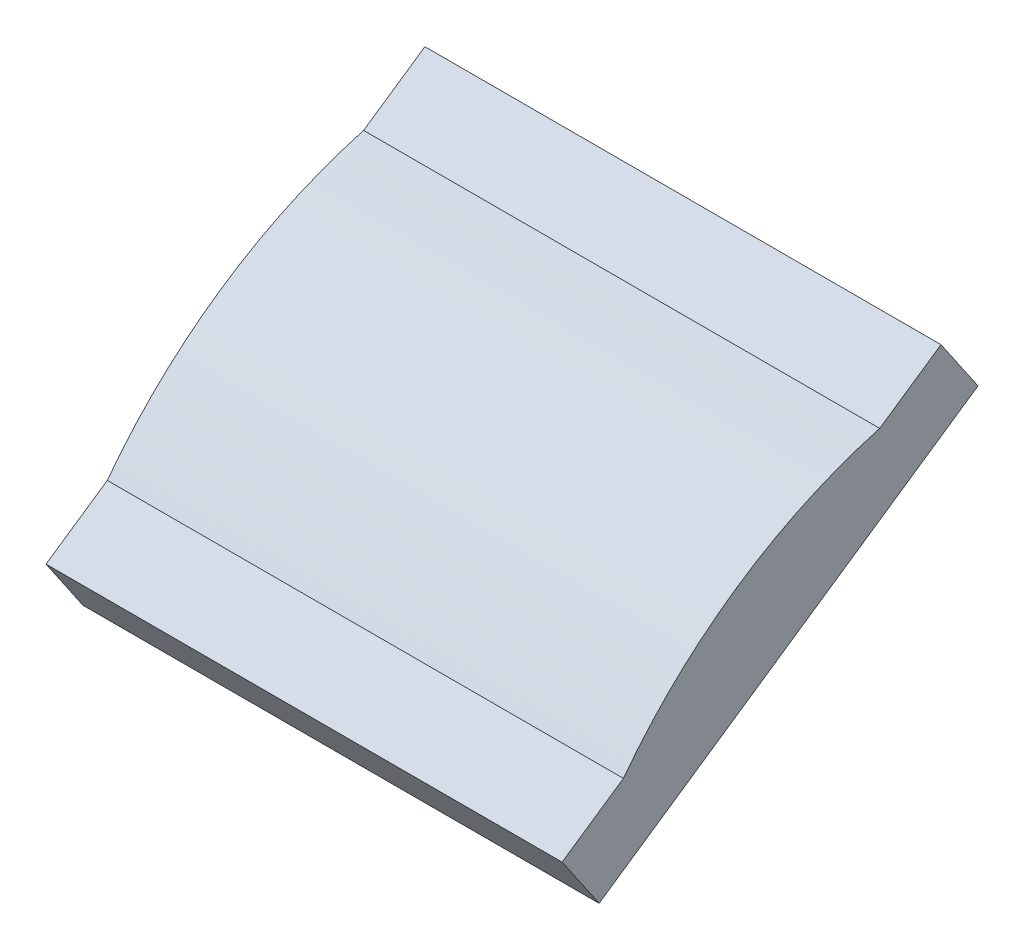
ISO-10303-21;
HEADER;
FILE_DESCRIPTION(('STEP AP214'),'2;1');
FILE_NAME('part.step','',(''),(''),'','','');
FILE_SCHEMA(('AUTOMOTIVE_DESIGN { 1 0 10303 214 1 1 1 1 }'));
ENDSEC;
DATA;
#1=APPLICATION_CONTEXT('core data for automotive mechanical design processes');
#2=APPLICATION_PROTOCOL_DEFINITION('international standard','automotive_design',2000,#1);
#3=PRODUCT_CONTEXT('',#1,'mechanical');
#4=PRODUCT('Part','Part','',(#3));
#5=PRODUCT_RELATED_PRODUCT_CATEGORY('part','',(#4));
#6=PRODUCT_DEFINITION_FORMATION('','',#4);
#7=PRODUCT_DEFINITION_CONTEXT('part definition',#1,'design');
#8=PRODUCT_DEFINITION('design','',#6,#7);
#9=PRODUCT_DEFINITION_SHAPE('','',#8);
#10=(LENGTH_UNIT() NAMED_UNIT(*) SI_UNIT(.MILLI.,.METRE.));
#11=(NAMED_UNIT(*) PLANE_ANGLE_UNIT() SI_UNIT($,.RADIAN.));
#12=(NAMED_UNIT(*) SI_UNIT($,.STERADIAN.) SOLID_ANGLE_UNIT());
#13=UNCERTAINTY_MEASURE_WITH_UNIT(LENGTH_MEASURE(1.E-05),#10,'distance_accuracy_value','');
#14=(GEOMETRIC_REPRESENTATION_CONTEXT(3) GLOBAL_UNCERTAINTY_ASSIGNED_CONTEXT((#13)) GLOBAL_UNIT_ASSIGNED_CONTEXT((#10,
#11,#12)) REPRESENTATION_CONTEXT('',''));
#15=CARTESIAN_POINT('',(0.,0.,0.));
#16=DIRECTION('',(0.,0.,1.));
#17=DIRECTION('',(1.,0.,0.));
#18=AXIS2_PLACEMENT_3D('',#15,#16,#17);
#19=CARTESIAN_POINT('',(5.,2.14734114764679,11.3943965351701));
#20=DIRECTION('',(0.,-0.185195909178902,-0.98270162064759));
#21=DIRECTION('',(0.,0.98270162064759,-0.185195909178902));
#22=AXIS2_PLACEMENT_3D('',#19,#20,#21);
#23=PLANE('',#22);
#24=DIRECTION('',(0.,-0.98270162064759,0.185195909178902));
#25=VECTOR('',#24,1.);
#26=CARTESIAN_POINT('',(0.,2.14734114764679,11.3943965351701));
#27=LINE('',#26,#25);
#28=CARTESIAN_POINT('',(0.,50.3985308913784,2.30117559627985));
#29=VERTEX_POINT('',#28);
#30=CARTESIAN_POINT('',(0.,3.98553334819268,11.0479783867994));
#31=VERTEX_POINT('',#30);
#32=EDGE_CURVE('E159',#29,#31,#27,.T.);
#33=ORIENTED_EDGE('',*,*,#32,.T.);
#34=DIRECTION('',(-1.,0.,0.));
#35=VECTOR('',#34,1.);
#36=CARTESIAN_POINT('',(5.,3.98553334819268,11.0479783867994));
#37=LINE('',#36,#35);
#38=CARTESIAN_POINT('',(5.,3.98553334819268,11.0479783867994));
#39=VERTEX_POINT('',#38);
#40=EDGE_CURVE('E200',#39,#31,#37,.T.);
#41=ORIENTED_EDGE('',*,*,#40,.F.);
#42=DIRECTION('',(0.,-0.98270162064759,0.185195909178902));
#43=VECTOR('',#42,1.);
#44=CARTESIAN_POINT('',(5.,2.14734114764679,11.3943965351701));
#45=LINE('',#44,#43);
#46=CARTESIAN_POINT('',(5.,50.3985308913779,2.30117559627943));
#47=VERTEX_POINT('',#46);
#48=EDGE_CURVE('E105',#47,#39,#45,.T.);
#49=ORIENTED_EDGE('',*,*,#48,.F.);
#50=DIRECTION('',(-1.,0.,0.));
#51=VECTOR('',#50,1.);
#52=CARTESIAN_POINT('',(5.,50.3985308913784,2.30117559627985));
#53=LINE('',#52,#51);
#54=EDGE_CURVE('E48',#47,#29,#53,.T.);
#55=ORIENTED_EDGE('',*,*,#54,.T.);
#56=EDGE_LOOP('',(#33,#41,#49,#55));
#57=FACE_BOUND('',#56,.T.);
#58=ADVANCED_FACE('F45',(#57),#23,.F.);
#59=CARTESIAN_POINT('',(5.,7.86317401586677,5.3694147198493));
#60=DIRECTION('',(0.,-0.825828263071328,-0.563921696614516));
#61=DIRECTION('',(0.,0.563921696614516,-0.825828263071328));
#62=AXIS2_PLACEMENT_3D('',#59,#60,#61);
#63=PLANE('',#62);
#64=DIRECTION('',(0.,-0.563921696614516,0.825828263071328));
#65=VECTOR('',#64,1.);
#66=CARTESIAN_POINT('',(0.,7.86317401586677,5.3694147198493));
#67=LINE('',#66,#65);
#68=CARTESIAN_POINT('',(0.,-13.9415373871828,37.3010588698369));
#69=VERTEX_POINT('',#68);
#70=EDGE_CURVE('E163',#31,#69,#67,.T.);
#71=ORIENTED_EDGE('',*,*,#70,.T.);
#72=DIRECTION('',(-1.,0.,0.));
#73=VECTOR('',#72,1.);
#74=CARTESIAN_POINT('',(5.,-13.9415373871828,37.3010588698369));
#75=LINE('',#74,#73);
#76=CARTESIAN_POINT('',(5.,-13.9415373871828,37.3010588698369));
#77=VERTEX_POINT('',#76);
#78=EDGE_CURVE('E197',#77,#69,#75,.T.);
#79=ORIENTED_EDGE('',*,*,#78,.F.);
#80=DIRECTION('',(0.,-0.563921696614516,0.825828263071328));
#81=VECTOR('',#80,1.);
#82=CARTESIAN_POINT('',(5.,7.86317401586677,5.3694147198493));
#83=LINE('',#82,#81);
#84=EDGE_CURVE('E222',#39,#77,#83,.T.);
#85=ORIENTED_EDGE('',*,*,#84,.F.);
#86=ORIENTED_EDGE('',*,*,#40,.T.);
#87=EDGE_LOOP('',(#71,#79,#85,#86));
#88=FACE_BOUND('',#87,.T.);
#89=ADVANCED_FACE('F218',(#88),#63,.F.);
#90=CARTESIAN_POINT('',(5.,-16.4791850219481,41.0172860536579));
#91=DIRECTION('',(-1.,0.,0.));
#92=DIRECTION('',(0.,0.,1.));
#93=AXIS2_PLACEMENT_3D('',#90,#91,#92);
#94=CYLINDRICAL_SURFACE('',#93,4.50000000000001);
#95=CARTESIAN_POINT('',(0.,-16.4791850219481,41.0172860536579));
#96=DIRECTION('',(1.,0.,0.));
#97=DIRECTION('',(0.,0.,-1.));
#98=AXIS2_PLACEMENT_3D('',#95,#96,#97);
#99=CIRCLE('',#98,4.50000000000001);
#100=CARTESIAN_POINT('',(0.,-16.1844106378081,36.5269510926048));
#101=VERTEX_POINT('',#100);
#102=EDGE_CURVE('E166',#69,#101,#99,.T.);
#103=ORIENTED_EDGE('',*,*,#102,.T.);
#104=DIRECTION('',(-1.,0.,0.));
#105=VECTOR('',#104,1.);
#106=CARTESIAN_POINT('',(5.,-16.1844106378081,36.5269510926048));
#107=LINE('',#106,#105);
#108=CARTESIAN_POINT('',(5.,-16.1844106378081,36.5269510926048));
#109=VERTEX_POINT('',#108);
#110=EDGE_CURVE('E133',#109,#101,#107,.T.);
#111=ORIENTED_EDGE('',*,*,#110,.F.);
#112=CARTESIAN_POINT('',(5.,-16.4791850219481,41.0172860536579));
#113=DIRECTION('',(1.,0.,0.));
#114=DIRECTION('',(0.,0.,-1.));
#115=AXIS2_PLACEMENT_3D('',#112,#113,#114);
#116=CIRCLE('',#115,4.50000000000001);
#117=EDGE_CURVE('E122',#77,#109,#116,.T.);
#118=ORIENTED_EDGE('',*,*,#117,.F.);
#119=ORIENTED_EDGE('',*,*,#78,.T.);
#120=EDGE_LOOP('',(#103,#111,#118,#119));
#121=FACE_BOUND('',#120,.T.);
#122=ADVANCED_FACE('F220',(#121),#94,.T.);
#123=CARTESIAN_POINT('',(5.,-13.7273897930276,-0.901153902144592));
#124=DIRECTION('',(0.,0.997852213567335,0.0655054186977738));
#125=DIRECTION('',(0.,-0.0655054186977738,0.997852213567335));
#126=AXIS2_PLACEMENT_3D('',#123,#124,#125);
#127=PLANE('',#126);
#128=DIRECTION('',(0.,0.0655054186977739,-0.997852213567335));
#129=VECTOR('',#128,1.);
#130=CARTESIAN_POINT('',(0.,-13.7273897930276,-0.901153902144592));
#131=LINE('',#130,#129);
#132=CARTESIAN_POINT('',(0.,-12.2095418312272,-24.022721226661));
#133=VERTEX_POINT('',#132);
#134=EDGE_CURVE('E131',#101,#133,#131,.T.);
#135=ORIENTED_EDGE('',*,*,#134,.T.);
#136=DIRECTION('',(-1.,0.,0.));
#137=VECTOR('',#136,1.);
#138=CARTESIAN_POINT('',(5.,-12.2095418312272,-24.022721226661));
#139=LINE('',#138,#137);
#140=CARTESIAN_POINT('',(5.,-12.2095418312272,-24.022721226661));
#141=VERTEX_POINT('',#140);
#142=EDGE_CURVE('E128',#141,#133,#139,.T.);
#143=ORIENTED_EDGE('',*,*,#142,.F.);
#144=DIRECTION('',(0.,0.0655054186977739,-0.997852213567335));
#145=VECTOR('',#144,1.);
#146=CARTESIAN_POINT('',(5.,-13.7273897930276,-0.901153902144592));
#147=LINE('',#146,#145);
#148=EDGE_CURVE('E115',#109,#141,#147,.T.);
#149=ORIENTED_EDGE('',*,*,#148,.F.);
#150=ORIENTED_EDGE('',*,*,#110,.T.);
#151=EDGE_LOOP('',(#135,#143,#149,#150));
#152=FACE_BOUND('',#151,.T.);
#153=ADVANCED_FACE('F129',(#152),#127,.F.);
#154=CARTESIAN_POINT('',(5.,-11.9147674470872,-28.513056187714));
#155=DIRECTION('',(-1.,0.,0.));
#156=DIRECTION('',(0.,0.,1.));
#157=AXIS2_PLACEMENT_3D('',#154,#155,#156);
#158=CYLINDRICAL_SURFACE('',#157,4.5);
#159=CARTESIAN_POINT('',(0.,-11.9147674470872,-28.513056187714));
#160=DIRECTION('',(1.,0.,0.));
#161=DIRECTION('',(0.,0.,-1.));
#162=AXIS2_PLACEMENT_3D('',#159,#160,#161);
#163=CIRCLE('',#162,4.5);
#164=CARTESIAN_POINT('',(0.,-7.66100021509012,-27.0449062171771));
#165=VERTEX_POINT('',#164);
#166=EDGE_CURVE('E90',#133,#165,#163,.T.);
#167=ORIENTED_EDGE('',*,*,#166,.T.);
#168=DIRECTION('',(-1.,0.,0.));
#169=VECTOR('',#168,1.);
#170=CARTESIAN_POINT('',(5.,-7.66100021509012,-27.0449062171771));
#171=LINE('',#170,#169);
#172=CARTESIAN_POINT('',(5.,-7.66100021509012,-27.0449062171771));
#173=VERTEX_POINT('',#172);
#174=EDGE_CURVE('E134',#173,#165,#171,.T.);
#175=ORIENTED_EDGE('',*,*,#174,.F.);
#176=CARTESIAN_POINT('',(5.,-11.9147674470872,-28.513056187714));
#177=DIRECTION('',(1.,0.,0.));
#178=DIRECTION('',(0.,0.,-1.));
#179=AXIS2_PLACEMENT_3D('',#176,#177,#178);
#180=CIRCLE('',#179,4.5);
#181=EDGE_CURVE('E120',#141,#173,#180,.T.);
#182=ORIENTED_EDGE('',*,*,#181,.F.);
#183=ORIENTED_EDGE('',*,*,#142,.T.);
#184=EDGE_LOOP('',(#167,#175,#182,#183));
#185=FACE_BOUND('',#184,.T.);
#186=ADVANCED_FACE('F136',(#185),#158,.T.);
#187=CARTESIAN_POINT('',(5.,7.52528279112857,-21.8034955493728));
#188=DIRECTION('',(0.,-0.326255549008214,0.945281607110468));
#189=DIRECTION('',(0.,-0.945281607110468,-0.326255549008214));
#190=AXIS2_PLACEMENT_3D('',#187,#188,#189);
#191=PLANE('',#190);
#192=DIRECTION('',(0.,0.945281607110468,0.326255549008214));
#193=VECTOR('',#192,1.);
#194=CARTESIAN_POINT('',(0.,7.52528279112857,-21.8034955493728));
#195=LINE('',#194,#193);
#196=CARTESIAN_POINT('',(0.,22.8148787981514,-16.5264273171522));
#197=VERTEX_POINT('',#196);
#198=EDGE_CURVE('E173',#165,#197,#195,.T.);
#199=ORIENTED_EDGE('',*,*,#198,.T.);
#200=DIRECTION('',(-1.,0.,0.));
#201=VECTOR('',#200,1.);
#202=CARTESIAN_POINT('',(5.,22.8148787981514,-16.5264273171522));
#203=LINE('',#202,#201);
#204=CARTESIAN_POINT('',(5.,22.8148787981514,-16.5264273171522));
#205=VERTEX_POINT('',#204);
#206=EDGE_CURVE('E97',#205,#197,#203,.T.);
#207=ORIENTED_EDGE('',*,*,#206,.F.);
#208=DIRECTION('',(0.,0.945281607110468,0.326255549008214));
#209=VECTOR('',#208,1.);
#210=CARTESIAN_POINT('',(5.,7.52528279112857,-21.8034955493728));
#211=LINE('',#210,#209);
#212=EDGE_CURVE('E63',#173,#205,#211,.T.);
#213=ORIENTED_EDGE('',*,*,#212,.F.);
#214=ORIENTED_EDGE('',*,*,#174,.T.);
#215=EDGE_LOOP('',(#199,#207,#213,#214));
#216=FACE_BOUND('',#215,.T.);
#217=ADVANCED_FACE('F384',(#216),#191,.F.);
#218=CARTESIAN_POINT('',(5.,-16.4791850219481,41.0172860536579));
#219=DIRECTION('',(-1.,0.,0.));
#220=DIRECTION('',(0.,0.,1.));
#221=AXIS2_PLACEMENT_3D('',#218,#219,#220);
#222=CYLINDRICAL_SURFACE('',#221,2.5);
#223=CARTESIAN_POINT('',(5.,-16.4791850219481,41.0172860536579));
#224=DIRECTION('',(1.,0.,0.));
#225=DIRECTION('',(0.,0.,-1.));
#226=AXIS2_PLACEMENT_3D('',#223,#224,#225);
#227=CIRCLE('',#226,2.5);
#228=CARTESIAN_POINT('',(5.,-16.4791850219481,38.5172860536579));
#229=VERTEX_POINT('',#228);
#230=EDGE_CURVE('E146',#229,#229,#227,.T.);
#231=ORIENTED_EDGE('',*,*,#230,.T.);
#232=EDGE_LOOP('',(#231));
#233=FACE_BOUND('',#232,.T.);
#234=CARTESIAN_POINT('',(0.,-16.4791850219481,41.0172860536579));
#235=DIRECTION('',(1.,0.,0.));
#236=DIRECTION('',(0.,0.,-1.));
#237=AXIS2_PLACEMENT_3D('',#234,#235,#236);
#238=CIRCLE('',#237,2.5);
#239=CARTESIAN_POINT('',(0.,-16.4791850219481,38.5172860536579));
#240=VERTEX_POINT('',#239);
#241=EDGE_CURVE('E180',#240,#240,#238,.T.);
#242=ORIENTED_EDGE('',*,*,#241,.F.);
#243=EDGE_LOOP('',(#242));
#244=FACE_BOUND('',#243,.T.);
#245=ADVANCED_FACE('F387',(#233,#244),#222,.F.);
#246=CARTESIAN_POINT('',(5.,1.27934877535807,1.52617620640661));
#247=DIRECTION('',(0.,-0.642414742923312,-0.766357160907873));
#248=DIRECTION('',(0.,0.766357160907873,-0.642414742923312));
#249=AXIS2_PLACEMENT_3D('',#246,#247,#248);
#250=PLANE('',#249);
#251=DIRECTION('',(0.,-0.766357160907873,0.642414742923312));
#252=VECTOR('',#251,1.);
#253=CARTESIAN_POINT('',(0.,1.27934877535807,1.52617620640661));
#254=LINE('',#253,#252);
#255=CARTESIAN_POINT('',(0.,117.368025310965,-95.7875582990304));
#256=VERTEX_POINT('',#255);
#257=EDGE_CURVE('E176',#256,#197,#254,.T.);
#258=ORIENTED_EDGE('',*,*,#257,.F.);
#259=DIRECTION('',(-1.,0.,0.));
#260=VECTOR('',#259,1.);
#261=CARTESIAN_POINT('',(5.,117.368025310965,-95.7875582990304));
#262=LINE('',#261,#260);
#263=CARTESIAN_POINT('',(5.,117.368025310965,-95.7875582990304));
#264=VERTEX_POINT('',#263);
#265=EDGE_CURVE('E154',#264,#256,#262,.T.);
#266=ORIENTED_EDGE('',*,*,#265,.F.);
#267=DIRECTION('',(0.,-0.766357160907873,0.642414742923312));
#268=VECTOR('',#267,1.);
#269=CARTESIAN_POINT('',(5.,1.27934877535807,1.52617620640661));
#270=LINE('',#269,#268);
#271=EDGE_CURVE('E140',#264,#205,#270,.T.);
#272=ORIENTED_EDGE('',*,*,#271,.T.);
#273=ORIENTED_EDGE('',*,*,#206,.T.);
#274=EDGE_LOOP('',(#258,#266,#272,#273));
#275=FACE_BOUND('',#274,.T.);
#276=ADVANCED_FACE('F389',(#275),#250,.T.);
#277=CARTESIAN_POINT('',(5.,-11.9147674470872,-28.513056187714));
#278=DIRECTION('',(-1.,0.,0.));
#279=DIRECTION('',(0.,0.,1.));
#280=AXIS2_PLACEMENT_3D('',#277,#278,#279);
#281=CYLINDRICAL_SURFACE('',#280,2.5);
#282=CARTESIAN_POINT('',(5.,-11.9147674470872,-28.513056187714));
#283=DIRECTION('',(1.,0.,0.));
#284=DIRECTION('',(0.,0.,-1.));
#285=AXIS2_PLACEMENT_3D('',#282,#283,#284);
#286=CIRCLE('',#285,2.5);
#287=CARTESIAN_POINT('',(5.,-11.9147674470872,-31.013056187714));
#288=VERTEX_POINT('',#287);
#289=EDGE_CURVE('E150',#288,#288,#286,.T.);
#290=ORIENTED_EDGE('',*,*,#289,.T.);
#291=EDGE_LOOP('',(#290));
#292=FACE_BOUND('',#291,.T.);
#293=CARTESIAN_POINT('',(0.,-11.9147674470872,-28.513056187714));
#294=DIRECTION('',(1.,0.,0.));
#295=DIRECTION('',(0.,0.,-1.));
#296=AXIS2_PLACEMENT_3D('',#293,#294,#295);
#297=CIRCLE('',#296,2.5);
#298=CARTESIAN_POINT('',(0.,-11.9147674470872,-31.013056187714));
#299=VERTEX_POINT('',#298);
#300=EDGE_CURVE('E184',#299,#299,#297,.T.);
#301=ORIENTED_EDGE('',*,*,#300,.F.);
#302=EDGE_LOOP('',(#301));
#303=FACE_BOUND('',#302,.T.);
#304=ADVANCED_FACE('F392',(#292,#303),#281,.F.);
#305=CARTESIAN_POINT('',(5.,0.,0.));
#306=DIRECTION('',(1.,0.,0.));
#307=DIRECTION('',(0.,0.,-1.));
#308=AXIS2_PLACEMENT_3D('',#305,#306,#307);
#309=PLANE('',#308);
#310=DIRECTION('',(0.,0.563858671546578,-0.825871296584237));
#311=VECTOR('',#310,1.);
#312=CARTESIAN_POINT('',(5.,50.3985308913784,2.30117559627985));
#313=LINE('',#312,#311);
#314=EDGE_CURVE('E11',#47,#264,#313,.T.);
#315=ORIENTED_EDGE('',*,*,#314,.F.);
#316=ORIENTED_EDGE('',*,*,#48,.T.);
#317=ORIENTED_EDGE('',*,*,#84,.T.);
#318=ORIENTED_EDGE('',*,*,#117,.T.);
#319=ORIENTED_EDGE('',*,*,#148,.T.);
#320=ORIENTED_EDGE('',*,*,#181,.T.);
#321=ORIENTED_EDGE('',*,*,#212,.T.);
#322=ORIENTED_EDGE('',*,*,#271,.F.);
#323=EDGE_LOOP('',(#315,#316,#317,#318,#319,#320,#321,#322));
#324=FACE_BOUND('',#323,.T.);
#325=ORIENTED_EDGE('',*,*,#230,.F.);
#326=EDGE_LOOP('',(#325));
#327=FACE_BOUND('',#326,.T.);
#328=ORIENTED_EDGE('',*,*,#289,.F.);
#329=EDGE_LOOP('',(#328));
#330=FACE_BOUND('',#329,.T.);
#331=ADVANCED_FACE('F117',(#324,#327,#330),#309,.T.);
#332=CARTESIAN_POINT('',(0.,0.,0.));
#333=DIRECTION('',(1.,0.,0.));
#334=DIRECTION('',(0.,0.,-1.));
#335=AXIS2_PLACEMENT_3D('',#332,#333,#334);
#336=PLANE('',#335);
#337=DIRECTION('',(0.,0.56385867154657,-0.825871296584242));
#338=VECTOR('',#337,1.);
#339=CARTESIAN_POINT('',(0.,35.4465924976813,24.2009483066669));
#340=LINE('',#339,#338);
#341=EDGE_CURVE('E155',#29,#256,#340,.T.);
#342=ORIENTED_EDGE('',*,*,#341,.T.);
#343=ORIENTED_EDGE('',*,*,#257,.T.);
#344=ORIENTED_EDGE('',*,*,#198,.F.);
#345=ORIENTED_EDGE('',*,*,#166,.F.);
#346=ORIENTED_EDGE('',*,*,#134,.F.);
#347=ORIENTED_EDGE('',*,*,#102,.F.);
#348=ORIENTED_EDGE('',*,*,#70,.F.);
#349=ORIENTED_EDGE('',*,*,#32,.F.);
#350=EDGE_LOOP('',(#342,#343,#344,#345,#346,#347,#348,#349));
#351=FACE_BOUND('',#350,.T.);
#352=ORIENTED_EDGE('',*,*,#241,.T.);
#353=EDGE_LOOP('',(#352));
#354=FACE_BOUND('',#353,.T.);
#355=ORIENTED_EDGE('',*,*,#300,.T.);
#356=EDGE_LOOP('',(#355));
#357=FACE_BOUND('',#356,.T.);
#358=ADVANCED_FACE('F214',(#351,#354,#357),#336,.F.);
#359=CARTESIAN_POINT('',(-271.45,-108.175443307666,234.560960334665));
#360=DIRECTION('',(0.,0.563858671546578,-0.825871296584237));
#361=DIRECTION('',(0.,0.825871296584237,0.563858671546578));
#362=AXIS2_PLACEMENT_3D('',#359,#360,#361);
#363=PLANE('',#362);
#364=DIRECTION('',(1.,0.,0.));
#365=VECTOR('',#364,1.);
#366=CARTESIAN_POINT('',(-271.45,-108.175443307666,234.560960334665));
#367=LINE('',#366,#365);
#368=CARTESIAN_POINT('',(-271.45,-108.175443307666,234.560960334665));
#369=VERTEX_POINT('',#368);
#370=CARTESIAN_POINT('',(178.55,-108.175443307666,234.560960334665));
#371=VERTEX_POINT('',#370);
#372=EDGE_CURVE('E247',#369,#371,#367,.T.);
#373=ORIENTED_EDGE('',*,*,#372,.T.);
#374=DIRECTION('',(0.,-0.825871296584237,-0.563858671546578));
#375=VECTOR('',#374,1.);
#376=CARTESIAN_POINT('',(178.55,-108.175443307666,234.560960334665));
#377=LINE('',#376,#375);
#378=CARTESIAN_POINT('',(178.55,-60.9356051430475,266.813676347129));
#379=VERTEX_POINT('',#378);
#380=EDGE_CURVE('E278',#379,#371,#377,.T.);
#381=ORIENTED_EDGE('',*,*,#380,.F.);
#382=DIRECTION('',(1.,0.,0.));
#383=VECTOR('',#382,1.);
#384=CARTESIAN_POINT('',(-271.45,-60.9356051430475,266.813676347129));
#385=LINE('',#384,#383);
#386=CARTESIAN_POINT('',(-271.45,-60.9356051430475,266.813676347129));
#387=VERTEX_POINT('',#386);
#388=EDGE_CURVE('E160',#387,#379,#385,.T.);
#389=ORIENTED_EDGE('',*,*,#388,.F.);
#390=DIRECTION('',(0.,0.825871296584237,0.563858671546578));
#391=VECTOR('',#390,1.);
#392=CARTESIAN_POINT('',(-271.45,-108.175443307666,234.560960334665));
#393=LINE('',#392,#391);
#394=EDGE_CURVE('E271',#369,#387,#393,.T.);
#395=ORIENTED_EDGE('',*,*,#394,.F.);
#396=EDGE_LOOP('',(#373,#381,#389,#395));
#397=FACE_BOUND('',#396,.T.);
#398=ADVANCED_FACE('F343',(#397),#363,.F.);
#399=CARTESIAN_POINT('',(-271.45,-60.9356051430475,266.813676347129));
#400=DIRECTION('',(0.,-0.825871296584237,-0.563858671546578));
#401=DIRECTION('',(0.,0.563858671546578,-0.825871296584237));
#402=AXIS2_PLACEMENT_3D('',#399,#400,#401);
#403=PLANE('',#402);
#404=ORIENTED_EDGE('',*,*,#388,.T.);
#405=DIRECTION('',(0.,-0.563858671546578,0.825871296584237));
#406=VECTOR('',#405,1.);
#407=CARTESIAN_POINT('',(178.55,-60.9356051430475,266.813676347129));
#408=LINE('',#407,#406);
#409=CARTESIAN_POINT('',(178.55,-24.442671920553,213.363286032197));
#410=VERTEX_POINT('',#409);
#411=EDGE_CURVE('E283',#410,#379,#408,.T.);
#412=ORIENTED_EDGE('',*,*,#411,.F.);
#413=DIRECTION('',(1.,0.,0.));
#414=VECTOR('',#413,1.);
#415=CARTESIAN_POINT('',(-271.45,-24.4426719205529,213.363286032197));
#416=LINE('',#415,#414);
#417=CARTESIAN_POINT('',(-271.45,-24.4426719205529,213.363286032197));
#418=VERTEX_POINT('',#417);
#419=EDGE_CURVE('E231',#418,#410,#416,.T.);
#420=ORIENTED_EDGE('',*,*,#419,.F.);
#421=DIRECTION('',(0.,0.563858671546578,-0.825871296584237));
#422=VECTOR('',#421,1.);
#423=CARTESIAN_POINT('',(-271.45,-60.9356051430475,266.813676347129));
#424=LINE('',#423,#422);
#425=EDGE_CURVE('E267',#387,#418,#424,.T.);
#426=ORIENTED_EDGE('',*,*,#425,.F.);
#427=EDGE_LOOP('',(#404,#412,#420,#426));
#428=FACE_BOUND('',#427,.T.);
#429=ADVANCED_FACE('F347',(#428),#403,.F.);
#430=CARTESIAN_POINT('',(-271.45,-275.113905810864,-121.583757266718));
#431=DIRECTION('',(1.,0.,0.));
#432=DIRECTION('',(0.,0.,-1.));
#433=AXIS2_PLACEMENT_3D('',#430,#431,#432);
#434=CYLINDRICAL_SURFACE('',#433,418.36059723016);
#435=ORIENTED_EDGE('',*,*,#419,.T.);
#436=CARTESIAN_POINT('',(178.55,-275.113905810861,-121.583757266716));
#437=DIRECTION('',(1.,0.,0.));
#438=DIRECTION('',(0.,0.,1.));
#439=AXIS2_PLACEMENT_3D('',#436,#437,#438);
#440=CIRCLE('',#439,418.360597230157);
#441=CARTESIAN_POINT('',(178.55,128.114930253089,-10.0844519716346));
#442=VERTEX_POINT('',#441);
#443=EDGE_CURVE('E287',#442,#410,#440,.T.);
#444=ORIENTED_EDGE('',*,*,#443,.F.);
#445=DIRECTION('',(1.,0.,0.));
#446=VECTOR('',#445,1.);
#447=CARTESIAN_POINT('',(-271.45,128.114930253089,-10.0844519716347));
#448=LINE('',#447,#446);
#449=CARTESIAN_POINT('',(-271.45,128.114930253089,-10.0844519716347));
#450=VERTEX_POINT('',#449);
#451=EDGE_CURVE('E235',#450,#442,#448,.T.);
#452=ORIENTED_EDGE('',*,*,#451,.F.);
#453=CARTESIAN_POINT('',(-271.45,-275.113905810864,-121.583757266718));
#454=DIRECTION('',(-1.,0.,0.));
#455=DIRECTION('',(0.,0.,-1.));
#456=AXIS2_PLACEMENT_3D('',#453,#454,#455);
#457=CIRCLE('',#456,418.36059723016);
#458=EDGE_CURVE('E263',#418,#450,#457,.T.);
#459=ORIENTED_EDGE('',*,*,#458,.F.);
#460=EDGE_LOOP('',(#435,#444,#452,#459));
#461=FACE_BOUND('',#460,.T.);
#462=ADVANCED_FACE('F355',(#461),#434,.T.);
#463=CARTESIAN_POINT('',(-271.45,164.607863475583,-63.5348422865665));
#464=DIRECTION('',(0.,-0.825871296584237,-0.563858671546578));
#465=DIRECTION('',(0.,0.563858671546578,-0.825871296584237));
#466=AXIS2_PLACEMENT_3D('',#463,#464,#465);
#467=PLANE('',#466);
#468=ORIENTED_EDGE('',*,*,#451,.T.);
#469=DIRECTION('',(0.,-0.563858671546578,0.825871296584236));
#470=VECTOR('',#469,1.);
#471=CARTESIAN_POINT('',(178.55,164.607863475583,-63.5348422865665));
#472=LINE('',#471,#470);
#473=CARTESIAN_POINT('',(178.55,164.607863475583,-63.5348422865665));
#474=VERTEX_POINT('',#473);
#475=EDGE_CURVE('E291',#474,#442,#472,.T.);
#476=ORIENTED_EDGE('',*,*,#475,.F.);
#477=DIRECTION('',(1.,0.,0.));
#478=VECTOR('',#477,1.);
#479=CARTESIAN_POINT('',(-271.45,164.607863475583,-63.5348422865665));
#480=LINE('',#479,#478);
#481=CARTESIAN_POINT('',(-271.45,164.607863475583,-63.5348422865665));
#482=VERTEX_POINT('',#481);
#483=EDGE_CURVE('E239',#482,#474,#480,.T.);
#484=ORIENTED_EDGE('',*,*,#483,.F.);
#485=DIRECTION('',(0.,0.563858671546578,-0.825871296584236));
#486=VECTOR('',#485,1.);
#487=CARTESIAN_POINT('',(-271.45,164.607863475583,-63.5348422865665));
#488=LINE('',#487,#486);
#489=EDGE_CURVE('E259',#450,#482,#488,.T.);
#490=ORIENTED_EDGE('',*,*,#489,.F.);
#491=EDGE_LOOP('',(#468,#476,#484,#490));
#492=FACE_BOUND('',#491,.T.);
#493=ADVANCED_FACE('F362',(#492),#467,.F.);
#494=CARTESIAN_POINT('',(-271.45,117.368025310965,-95.7875582990304));
#495=DIRECTION('',(0.,-0.563858671546572,0.825871296584241));
#496=DIRECTION('',(0.,-0.825871296584241,-0.563858671546572));
#497=AXIS2_PLACEMENT_3D('',#494,#495,#496);
#498=PLANE('',#497);
#499=ORIENTED_EDGE('',*,*,#483,.T.);
#500=DIRECTION('',(0.,0.825871296584241,0.563858671546572));
#501=VECTOR('',#500,1.);
#502=CARTESIAN_POINT('',(178.55,117.368025310965,-95.7875582990304));
#503=LINE('',#502,#501);
#504=CARTESIAN_POINT('',(178.55,117.368025310965,-95.7875582990304));
#505=VERTEX_POINT('',#504);
#506=EDGE_CURVE('E295',#505,#474,#503,.T.);
#507=ORIENTED_EDGE('',*,*,#506,.F.);
#508=DIRECTION('',(-1.,0.,0.));
#509=VECTOR('',#508,1.);
#510=CARTESIAN_POINT('',(178.55,117.368025310965,-95.7875582990304));
#511=LINE('',#510,#509);
#512=EDGE_CURVE('E275',#505,#264,#511,.T.);
#513=ORIENTED_EDGE('',*,*,#512,.T.);
#514=ORIENTED_EDGE('',*,*,#265,.T.);
#515=DIRECTION('',(1.,0.,0.));
#516=VECTOR('',#515,1.);
#517=CARTESIAN_POINT('',(-271.45,117.368025310965,-95.7875582990304));
#518=LINE('',#517,#516);
#519=CARTESIAN_POINT('',(-271.45,117.368025310965,-95.7875582990304));
#520=VERTEX_POINT('',#519);
#521=EDGE_CURVE('E243',#520,#256,#518,.T.);
#522=ORIENTED_EDGE('',*,*,#521,.F.);
#523=DIRECTION('',(0.,-0.825871296584241,-0.563858671546572));
#524=VECTOR('',#523,1.);
#525=CARTESIAN_POINT('',(-271.45,117.368025310965,-95.7875582990304));
#526=LINE('',#525,#524);
#527=EDGE_CURVE('E255',#482,#520,#526,.T.);
#528=ORIENTED_EDGE('',*,*,#527,.F.);
#529=EDGE_LOOP('',(#499,#507,#513,#514,#522,#528));
#530=FACE_BOUND('',#529,.T.);
#531=ADVANCED_FACE('F317',(#530),#498,.F.);
#532=CARTESIAN_POINT('',(-271.45,-108.175443307666,234.560960334665));
#533=DIRECTION('',(0.,0.825871296584238,0.563858671546576));
#534=DIRECTION('',(0.,-0.563858671546576,0.825871296584238));
#535=AXIS2_PLACEMENT_3D('',#532,#533,#534);
#536=PLANE('',#535);
#537=ORIENTED_EDGE('',*,*,#341,.F.);
#538=ORIENTED_EDGE('',*,*,#54,.F.);
#539=ORIENTED_EDGE('',*,*,#314,.T.);
#540=ORIENTED_EDGE('',*,*,#512,.F.);
#541=DIRECTION('',(0.,0.563858671546572,-0.825871296584241));
#542=VECTOR('',#541,1.);
#543=CARTESIAN_POINT('',(178.55,50.3985308913784,2.30117559627985));
#544=LINE('',#543,#542);
#545=EDGE_CURVE('E299',#371,#505,#544,.T.);
#546=ORIENTED_EDGE('',*,*,#545,.F.);
#547=ORIENTED_EDGE('',*,*,#372,.F.);
#548=DIRECTION('',(0.,-0.563858671546576,0.825871296584238));
#549=VECTOR('',#548,1.);
#550=CARTESIAN_POINT('',(-271.45,-108.175443307666,234.560960334665));
#551=LINE('',#550,#549);
#552=EDGE_CURVE('E251',#520,#369,#551,.T.);
#553=ORIENTED_EDGE('',*,*,#552,.F.);
#554=ORIENTED_EDGE('',*,*,#521,.T.);
#555=EDGE_LOOP('',(#537,#538,#539,#540,#546,#547,#553,#554));
#556=FACE_BOUND('',#555,.T.);
#557=ADVANCED_FACE('F315',(#556),#536,.F.);
#558=CARTESIAN_POINT('',(-271.45,-275.113905810864,-121.583757266718));
#559=DIRECTION('',(1.,0.,0.));
#560=DIRECTION('',(0.,0.,-1.));
#561=AXIS2_PLACEMENT_3D('',#558,#559,#560);
#562=PLANE('',#561);
#563=ORIENTED_EDGE('',*,*,#394,.T.);
#564=ORIENTED_EDGE('',*,*,#425,.T.);
#565=ORIENTED_EDGE('',*,*,#458,.T.);
#566=ORIENTED_EDGE('',*,*,#489,.T.);
#567=ORIENTED_EDGE('',*,*,#527,.T.);
#568=ORIENTED_EDGE('',*,*,#552,.T.);
#569=EDGE_LOOP('',(#563,#564,#565,#566,#567,#568));
#570=FACE_BOUND('',#569,.T.);
#571=ADVANCED_FACE('F338',(#570),#562,.F.);
#572=CARTESIAN_POINT('',(178.55,-275.113905810861,-121.583757266716));
#573=DIRECTION('',(-1.,0.,0.));
#574=DIRECTION('',(0.,0.,1.));
#575=AXIS2_PLACEMENT_3D('',#572,#573,#574);
#576=PLANE('',#575);
#577=ORIENTED_EDGE('',*,*,#545,.T.);
#578=ORIENTED_EDGE('',*,*,#506,.T.);
#579=ORIENTED_EDGE('',*,*,#475,.T.);
#580=ORIENTED_EDGE('',*,*,#443,.T.);
#581=ORIENTED_EDGE('',*,*,#411,.T.);
#582=ORIENTED_EDGE('',*,*,#380,.T.);
#583=EDGE_LOOP('',(#577,#578,#579,#580,#581,#582));
#584=FACE_BOUND('',#583,.T.);
#585=ADVANCED_FACE('F306',(#584),#576,.F.);
#586=CLOSED_SHELL('',(#58,#89,#122,#153,#186,#217,#245,#276,#304,#331,#358,#398,#429,#462,#493,
#531,#557,#571,#585));
#587=MANIFOLD_SOLID_BREP('B2',#586);
#588=ADVANCED_BREP_SHAPE_REPRESENTATION('',(#18,#587),#14);
#589=SHAPE_DEFINITION_REPRESENTATION(#9,#588);
ENDSEC;
END-ISO-10303-21;
